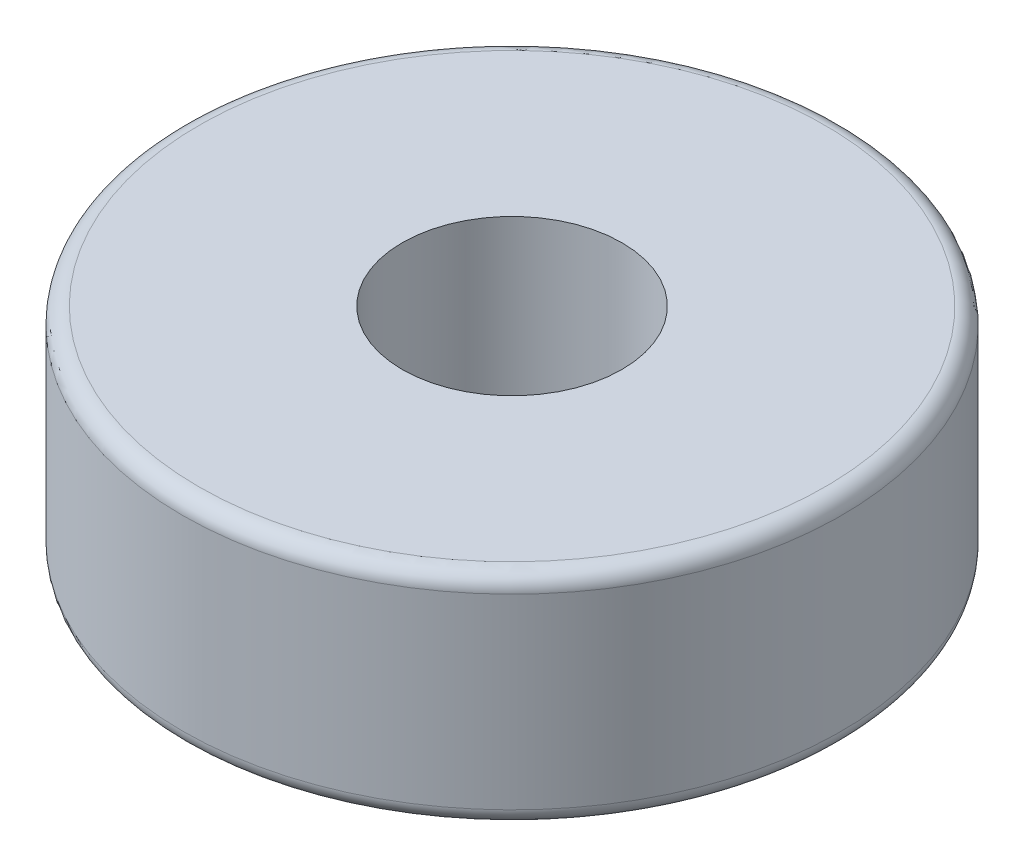
ISO-10303-21;
HEADER;
FILE_DESCRIPTION(('STEP AP214'),'2;1');
FILE_NAME('part.step','',(''),(''),'','','');
FILE_SCHEMA(('AUTOMOTIVE_DESIGN { 1 0 10303 214 1 1 1 1 }'));
ENDSEC;
DATA;
#1=APPLICATION_CONTEXT('core data for automotive mechanical design processes');
#2=APPLICATION_PROTOCOL_DEFINITION('international standard','automotive_design',2000,#1);
#3=PRODUCT_CONTEXT('',#1,'mechanical');
#4=PRODUCT('Part','Part','',(#3));
#5=PRODUCT_RELATED_PRODUCT_CATEGORY('part','',(#4));
#6=PRODUCT_DEFINITION_FORMATION('','',#4);
#7=PRODUCT_DEFINITION_CONTEXT('part definition',#1,'design');
#8=PRODUCT_DEFINITION('design','',#6,#7);
#9=PRODUCT_DEFINITION_SHAPE('','',#8);
#10=(LENGTH_UNIT() NAMED_UNIT(*) SI_UNIT(.MILLI.,.METRE.));
#11=(NAMED_UNIT(*) PLANE_ANGLE_UNIT() SI_UNIT($,.RADIAN.));
#12=(NAMED_UNIT(*) SI_UNIT($,.STERADIAN.) SOLID_ANGLE_UNIT());
#13=UNCERTAINTY_MEASURE_WITH_UNIT(LENGTH_MEASURE(1.E-05),#10,'distance_accuracy_value','');
#14=(GEOMETRIC_REPRESENTATION_CONTEXT(3) GLOBAL_UNCERTAINTY_ASSIGNED_CONTEXT((#13)) GLOBAL_UNIT_ASSIGNED_CONTEXT((#10,
#11,#12)) REPRESENTATION_CONTEXT('',''));
#15=CARTESIAN_POINT('',(0.,0.,0.));
#16=DIRECTION('',(0.,0.,1.));
#17=DIRECTION('',(1.,0.,0.));
#18=AXIS2_PLACEMENT_3D('',#15,#16,#17);
#19=CARTESIAN_POINT('',(0.,4.,0.));
#20=DIRECTION('',(0.,1.,0.));
#21=DIRECTION('',(0.,0.,1.));
#22=AXIS2_PLACEMENT_3D('',#19,#20,#21);
#23=PLANE('',#22);
#24=CARTESIAN_POINT('',(0.,4.,0.));
#25=DIRECTION('',(0.,1.,0.));
#26=DIRECTION('',(0.,0.,1.));
#27=AXIS2_PLACEMENT_3D('',#24,#25,#26);
#28=CIRCLE('',#27,5.7);
#29=CARTESIAN_POINT('',(0.,4.,5.7));
#30=VERTEX_POINT('',#29);
#31=EDGE_CURVE('E10',#30,#30,#28,.T.);
#32=ORIENTED_EDGE('',*,*,#31,.T.);
#33=EDGE_LOOP('',(#32));
#34=FACE_BOUND('',#33,.T.);
#35=CARTESIAN_POINT('',(0.,4.,0.));
#36=DIRECTION('',(0.,1.,0.));
#37=DIRECTION('',(0.,0.,1.));
#38=AXIS2_PLACEMENT_3D('',#35,#36,#37);
#39=CIRCLE('',#38,2.);
#40=CARTESIAN_POINT('',(0.,4.,2.));
#41=VERTEX_POINT('',#40);
#42=EDGE_CURVE('E63',#41,#41,#39,.T.);
#43=ORIENTED_EDGE('',*,*,#42,.F.);
#44=EDGE_LOOP('',(#43));
#45=FACE_BOUND('',#44,.T.);
#46=ADVANCED_FACE('F38',(#34,#45),#23,.T.);
#47=CARTESIAN_POINT('',(0.,0.,0.));
#48=DIRECTION('',(0.,1.,0.));
#49=DIRECTION('',(0.,0.,1.));
#50=AXIS2_PLACEMENT_3D('',#47,#48,#49);
#51=PLANE('',#50);
#52=CARTESIAN_POINT('',(0.,0.,0.));
#53=DIRECTION('',(0.,1.,0.));
#54=DIRECTION('',(0.,0.,1.));
#55=AXIS2_PLACEMENT_3D('',#52,#53,#54);
#56=CIRCLE('',#55,5.7);
#57=CARTESIAN_POINT('',(0.,0.,5.7));
#58=VERTEX_POINT('',#57);
#59=EDGE_CURVE('E46',#58,#58,#56,.F.);
#60=ORIENTED_EDGE('',*,*,#59,.T.);
#61=EDGE_LOOP('',(#60));
#62=FACE_BOUND('',#61,.T.);
#63=CARTESIAN_POINT('',(0.,0.,0.));
#64=DIRECTION('',(0.,1.,0.));
#65=DIRECTION('',(0.,0.,1.));
#66=AXIS2_PLACEMENT_3D('',#63,#64,#65);
#67=CIRCLE('',#66,2.);
#68=CARTESIAN_POINT('',(0.,0.,2.));
#69=VERTEX_POINT('',#68);
#70=EDGE_CURVE('E64',#69,#69,#67,.T.);
#71=ORIENTED_EDGE('',*,*,#70,.T.);
#72=EDGE_LOOP('',(#71));
#73=FACE_BOUND('',#72,.T.);
#74=ADVANCED_FACE('F75',(#62,#73),#51,.F.);
#75=CARTESIAN_POINT('',(0.,4.,0.));
#76=DIRECTION('',(0.,-1.,0.));
#77=DIRECTION('',(0.,0.,-1.));
#78=AXIS2_PLACEMENT_3D('',#75,#76,#77);
#79=CYLINDRICAL_SURFACE('',#78,6.);
#80=CARTESIAN_POINT('',(0.,0.3,0.));
#81=DIRECTION('',(0.,1.,0.));
#82=DIRECTION('',(0.,0.,1.));
#83=AXIS2_PLACEMENT_3D('',#80,#81,#82);
#84=CIRCLE('',#83,6.);
#85=CARTESIAN_POINT('',(0.,0.3,6.));
#86=VERTEX_POINT('',#85);
#87=EDGE_CURVE('E51',#86,#86,#84,.T.);
#88=ORIENTED_EDGE('',*,*,#87,.T.);
#89=EDGE_LOOP('',(#88));
#90=FACE_BOUND('',#89,.T.);
#91=CARTESIAN_POINT('',(0.,3.7,0.));
#92=DIRECTION('',(0.,1.,0.));
#93=DIRECTION('',(0.,0.,1.));
#94=AXIS2_PLACEMENT_3D('',#91,#92,#93);
#95=CIRCLE('',#94,6.);
#96=CARTESIAN_POINT('',(0.,3.7,6.));
#97=VERTEX_POINT('',#96);
#98=EDGE_CURVE('E57',#97,#97,#95,.F.);
#99=ORIENTED_EDGE('',*,*,#98,.T.);
#100=EDGE_LOOP('',(#99));
#101=FACE_BOUND('',#100,.T.);
#102=ADVANCED_FACE('F80',(#90,#101),#79,.T.);
#103=CARTESIAN_POINT('',(0.,4.,0.));
#104=DIRECTION('',(0.,-1.,0.));
#105=DIRECTION('',(0.,0.,-1.));
#106=AXIS2_PLACEMENT_3D('',#103,#104,#105);
#107=CYLINDRICAL_SURFACE('',#106,2.);
#108=ORIENTED_EDGE('',*,*,#42,.T.);
#109=EDGE_LOOP('',(#108));
#110=FACE_BOUND('',#109,.T.);
#111=ORIENTED_EDGE('',*,*,#70,.F.);
#112=EDGE_LOOP('',(#111));
#113=FACE_BOUND('',#112,.T.);
#114=ADVANCED_FACE('F71',(#110,#113),#107,.F.);
#115=CARTESIAN_POINT('',(0.,0.3,0.));
#116=DIRECTION('',(0.,1.,0.));
#117=DIRECTION('',(0.,0.,1.));
#118=AXIS2_PLACEMENT_3D('',#115,#116,#117);
#119=TOROIDAL_SURFACE('',#118,5.7,0.3);
#120=ORIENTED_EDGE('',*,*,#59,.F.);
#121=EDGE_LOOP('',(#120));
#122=FACE_BOUND('',#121,.T.);
#123=ORIENTED_EDGE('',*,*,#87,.F.);
#124=EDGE_LOOP('',(#123));
#125=FACE_BOUND('',#124,.T.);
#126=ADVANCED_FACE('F86',(#122,#125),#119,.T.);
#127=CARTESIAN_POINT('',(0.,3.7,0.));
#128=DIRECTION('',(0.,1.,0.));
#129=DIRECTION('',(0.,0.,1.));
#130=AXIS2_PLACEMENT_3D('',#127,#128,#129);
#131=TOROIDAL_SURFACE('',#130,5.7,0.3);
#132=ORIENTED_EDGE('',*,*,#98,.F.);
#133=EDGE_LOOP('',(#132));
#134=FACE_BOUND('',#133,.T.);
#135=ORIENTED_EDGE('',*,*,#31,.F.);
#136=EDGE_LOOP('',(#135));
#137=FACE_BOUND('',#136,.T.);
#138=ADVANCED_FACE('F40',(#134,#137),#131,.T.);
#139=CLOSED_SHELL('',(#46,#74,#102,#114,#126,#138));
#140=MANIFOLD_SOLID_BREP('B2',#139);
#141=ADVANCED_BREP_SHAPE_REPRESENTATION('',(#18,#140),#14);
#142=SHAPE_DEFINITION_REPRESENTATION(#9,#141);
ENDSEC;
END-ISO-10303-21;
